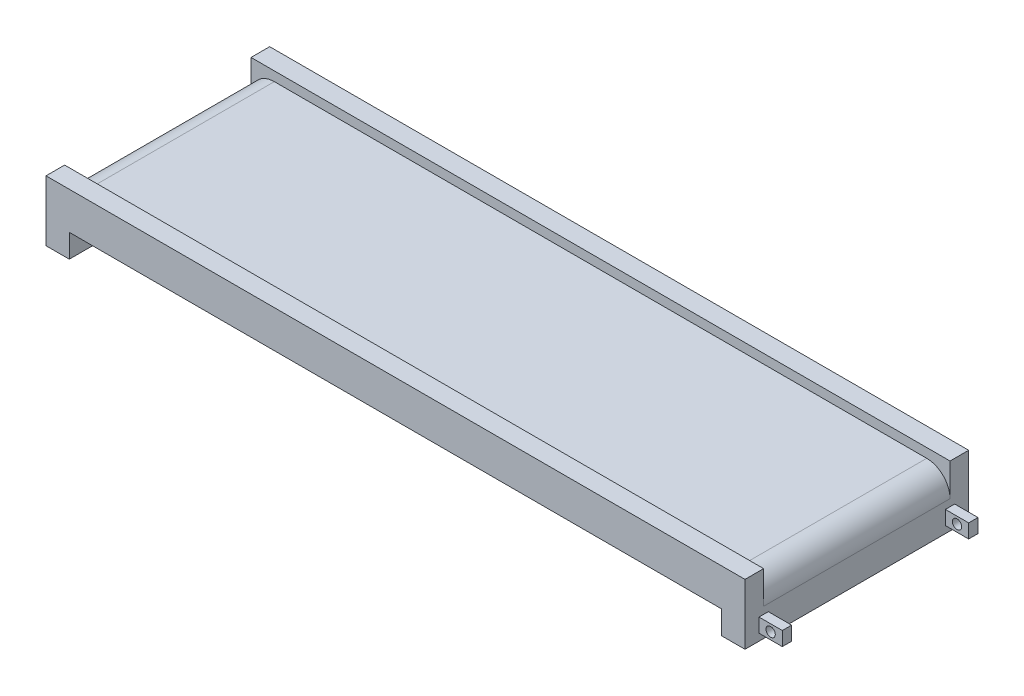
ISO-10303-21;
HEADER;
FILE_DESCRIPTION(('STEP AP214'),'2;1');
FILE_NAME('part.step','',(''),(''),'','','');
FILE_SCHEMA(('AUTOMOTIVE_DESIGN { 1 0 10303 214 1 1 1 1 }'));
ENDSEC;
DATA;
#1=APPLICATION_CONTEXT('core data for automotive mechanical design processes');
#2=APPLICATION_PROTOCOL_DEFINITION('international standard','automotive_design',2000,#1);
#3=PRODUCT_CONTEXT('',#1,'mechanical');
#4=PRODUCT('Part','Part','',(#3));
#5=PRODUCT_RELATED_PRODUCT_CATEGORY('part','',(#4));
#6=PRODUCT_DEFINITION_FORMATION('','',#4);
#7=PRODUCT_DEFINITION_CONTEXT('part definition',#1,'design');
#8=PRODUCT_DEFINITION('design','',#6,#7);
#9=PRODUCT_DEFINITION_SHAPE('','',#8);
#10=(LENGTH_UNIT() NAMED_UNIT(*) SI_UNIT(.MILLI.,.METRE.));
#11=(NAMED_UNIT(*) PLANE_ANGLE_UNIT() SI_UNIT($,.RADIAN.));
#12=(NAMED_UNIT(*) SI_UNIT($,.STERADIAN.) SOLID_ANGLE_UNIT());
#13=UNCERTAINTY_MEASURE_WITH_UNIT(LENGTH_MEASURE(1.E-05),#10,'distance_accuracy_value','');
#14=(GEOMETRIC_REPRESENTATION_CONTEXT(3) GLOBAL_UNCERTAINTY_ASSIGNED_CONTEXT((#13)) GLOBAL_UNIT_ASSIGNED_CONTEXT((#10,
#11,#12)) REPRESENTATION_CONTEXT('',''));
#15=CARTESIAN_POINT('',(0.,0.,0.));
#16=DIRECTION('',(0.,0.,1.));
#17=DIRECTION('',(1.,0.,0.));
#18=AXIS2_PLACEMENT_3D('',#15,#16,#17);
#19=CARTESIAN_POINT('',(0.,0.,0.));
#20=DIRECTION('',(0.,-1.,0.));
#21=DIRECTION('',(0.,0.,-1.));
#22=AXIS2_PLACEMENT_3D('',#19,#20,#21);
#23=PLANE('',#22);
#24=DIRECTION('',(-1.,0.,0.));
#25=VECTOR('',#24,1.);
#26=CARTESIAN_POINT('',(0.,0.,0.));
#27=LINE('',#26,#25);
#28=CARTESIAN_POINT('',(3683.,0.,0.));
#29=VERTEX_POINT('',#28);
#30=CARTESIAN_POINT('',(127.,0.,0.));
#31=VERTEX_POINT('',#30);
#32=EDGE_CURVE('E335',#29,#31,#27,.T.);
#33=ORIENTED_EDGE('',*,*,#32,.F.);
#34=DIRECTION('',(0.,0.,-1.));
#35=VECTOR('',#34,1.);
#36=CARTESIAN_POINT('',(3683.,0.,0.));
#37=LINE('',#36,#35);
#38=CARTESIAN_POINT('',(3683.,0.,1219.2));
#39=VERTEX_POINT('',#38);
#40=EDGE_CURVE('E260',#39,#29,#37,.T.);
#41=ORIENTED_EDGE('',*,*,#40,.F.);
#42=DIRECTION('',(1.,0.,0.));
#43=VECTOR('',#42,1.);
#44=CARTESIAN_POINT('',(3810.,0.,1219.2));
#45=LINE('',#44,#43);
#46=CARTESIAN_POINT('',(127.,0.,1219.2));
#47=VERTEX_POINT('',#46);
#48=EDGE_CURVE('E312',#47,#39,#45,.T.);
#49=ORIENTED_EDGE('',*,*,#48,.F.);
#50=DIRECTION('',(0.,0.,-1.));
#51=VECTOR('',#50,1.);
#52=CARTESIAN_POINT('',(127.,0.,0.));
#53=LINE('',#52,#51);
#54=EDGE_CURVE('E278',#47,#31,#53,.T.);
#55=ORIENTED_EDGE('',*,*,#54,.T.);
#56=EDGE_LOOP('',(#33,#41,#49,#55));
#57=FACE_BOUND('',#56,.T.);
#58=ADVANCED_FACE('F39',(#57),#23,.T.);
#59=CARTESIAN_POINT('',(0.,203.2,1219.2));
#60=DIRECTION('',(1.,0.,0.));
#61=DIRECTION('',(0.,0.,-1.));
#62=AXIS2_PLACEMENT_3D('',#59,#60,#61);
#63=PLANE('',#62);
#64=DIRECTION('',(0.,1.,0.));
#65=VECTOR('',#64,1.);
#66=CARTESIAN_POINT('',(0.,152.4,1117.6));
#67=LINE('',#66,#65);
#68=CARTESIAN_POINT('',(0.,25.4,1117.6));
#69=VERTEX_POINT('',#68);
#70=CARTESIAN_POINT('',(0.,203.2,1117.6));
#71=VERTEX_POINT('',#70);
#72=EDGE_CURVE('E310',#69,#71,#67,.T.);
#73=ORIENTED_EDGE('',*,*,#72,.F.);
#74=DIRECTION('',(0.,0.,1.));
#75=VECTOR('',#74,1.);
#76=CARTESIAN_POINT('',(0.,25.4,101.6));
#77=LINE('',#76,#75);
#78=CARTESIAN_POINT('',(0.,25.4,101.6));
#79=VERTEX_POINT('',#78);
#80=EDGE_CURVE('E350',#69,#79,#77,.F.);
#81=ORIENTED_EDGE('',*,*,#80,.T.);
#82=DIRECTION('',(0.,1.,0.));
#83=VECTOR('',#82,1.);
#84=CARTESIAN_POINT('',(0.,152.4,101.6));
#85=LINE('',#84,#83);
#86=CARTESIAN_POINT('',(0.,203.2,101.6));
#87=VERTEX_POINT('',#86);
#88=EDGE_CURVE('E313',#79,#87,#85,.T.);
#89=ORIENTED_EDGE('',*,*,#88,.T.);
#90=DIRECTION('',(0.,0.,1.));
#91=VECTOR('',#90,1.);
#92=CARTESIAN_POINT('',(0.,203.2,1219.2));
#93=LINE('',#92,#91);
#94=CARTESIAN_POINT('',(0.,203.2,0.));
#95=VERTEX_POINT('',#94);
#96=EDGE_CURVE('E320',#95,#87,#93,.T.);
#97=ORIENTED_EDGE('',*,*,#96,.F.);
#98=DIRECTION('',(0.,-1.,0.));
#99=VECTOR('',#98,1.);
#100=CARTESIAN_POINT('',(0.,203.2,0.));
#101=LINE('',#100,#99);
#102=CARTESIAN_POINT('',(0.,-127.,0.));
#103=VERTEX_POINT('',#102);
#104=EDGE_CURVE('E332',#95,#103,#101,.T.);
#105=ORIENTED_EDGE('',*,*,#104,.T.);
#106=DIRECTION('',(0.,0.,-1.));
#107=VECTOR('',#106,1.);
#108=CARTESIAN_POINT('',(0.,-127.,0.));
#109=LINE('',#108,#107);
#110=CARTESIAN_POINT('',(0.,-127.,1219.2));
#111=VERTEX_POINT('',#110);
#112=EDGE_CURVE('E285',#111,#103,#109,.T.);
#113=ORIENTED_EDGE('',*,*,#112,.F.);
#114=DIRECTION('',(0.,-1.,0.));
#115=VECTOR('',#114,1.);
#116=CARTESIAN_POINT('',(0.,203.2,1219.2));
#117=LINE('',#116,#115);
#118=CARTESIAN_POINT('',(0.,203.2,1219.2));
#119=VERTEX_POINT('',#118);
#120=EDGE_CURVE('E342',#119,#111,#117,.T.);
#121=ORIENTED_EDGE('',*,*,#120,.F.);
#122=EDGE_CURVE('E324',#71,#119,#93,.T.);
#123=ORIENTED_EDGE('',*,*,#122,.F.);
#124=EDGE_LOOP('',(#73,#81,#89,#97,#105,#113,#121,#123));
#125=FACE_BOUND('',#124,.T.);
#126=ADVANCED_FACE('F381',(#125),#63,.F.);
#127=CARTESIAN_POINT('',(3810.,203.2,0.));
#128=DIRECTION('',(-1.,0.,0.));
#129=DIRECTION('',(0.,0.,1.));
#130=AXIS2_PLACEMENT_3D('',#127,#128,#129);
#131=PLANE('',#130);
#132=DIRECTION('',(0.,1.,0.));
#133=VECTOR('',#132,1.);
#134=CARTESIAN_POINT('',(3810.,0.,127.));
#135=LINE('',#134,#133);
#136=CARTESIAN_POINT('',(3810.,-88.9,127.));
#137=VERTEX_POINT('',#136);
#138=CARTESIAN_POINT('',(3810.,-12.7,127.));
#139=VERTEX_POINT('',#138);
#140=EDGE_CURVE('E221',#137,#139,#135,.T.);
#141=ORIENTED_EDGE('',*,*,#140,.T.);
#142=DIRECTION('',(0.,0.,-1.));
#143=VECTOR('',#142,1.);
#144=CARTESIAN_POINT('',(3810.,-12.7,0.));
#145=LINE('',#144,#143);
#146=CARTESIAN_POINT('',(3810.,-12.7,76.2000000000001));
#147=VERTEX_POINT('',#146);
#148=EDGE_CURVE('E194',#139,#147,#145,.T.);
#149=ORIENTED_EDGE('',*,*,#148,.T.);
#150=DIRECTION('',(0.,-1.,0.));
#151=VECTOR('',#150,1.);
#152=CARTESIAN_POINT('',(3810.,0.,76.2000000000001));
#153=LINE('',#152,#151);
#154=CARTESIAN_POINT('',(3810.,-88.9000000000001,76.2000000000001));
#155=VERTEX_POINT('',#154);
#156=EDGE_CURVE('E210',#147,#155,#153,.T.);
#157=ORIENTED_EDGE('',*,*,#156,.T.);
#158=DIRECTION('',(0.,0.,1.));
#159=VECTOR('',#158,1.);
#160=CARTESIAN_POINT('',(3810.,-88.9,0.));
#161=LINE('',#160,#159);
#162=EDGE_CURVE('E55',#155,#137,#161,.T.);
#163=ORIENTED_EDGE('',*,*,#162,.T.);
#164=EDGE_LOOP('',(#141,#149,#157,#163));
#165=FACE_BOUND('',#164,.T.);
#166=DIRECTION('',(0.,0.,-1.));
#167=VECTOR('',#166,1.);
#168=CARTESIAN_POINT('',(3810.,-12.7000000000006,0.));
#169=LINE('',#168,#167);
#170=CARTESIAN_POINT('',(3810.,-12.7,1143.));
#171=VERTEX_POINT('',#170);
#172=CARTESIAN_POINT('',(3810.,-12.7,1092.2));
#173=VERTEX_POINT('',#172);
#174=EDGE_CURVE('E247',#171,#173,#169,.T.);
#175=ORIENTED_EDGE('',*,*,#174,.T.);
#176=DIRECTION('',(0.,-1.,0.));
#177=VECTOR('',#176,1.);
#178=CARTESIAN_POINT('',(3810.,0.,1092.2));
#179=LINE('',#178,#177);
#180=CARTESIAN_POINT('',(3810.,-88.9,1092.2));
#181=VERTEX_POINT('',#180);
#182=EDGE_CURVE('E199',#173,#181,#179,.T.);
#183=ORIENTED_EDGE('',*,*,#182,.T.);
#184=DIRECTION('',(0.,0.,1.));
#185=VECTOR('',#184,1.);
#186=CARTESIAN_POINT('',(3810.,-88.9,0.));
#187=LINE('',#186,#185);
#188=CARTESIAN_POINT('',(3810.,-88.9,1143.));
#189=VERTEX_POINT('',#188);
#190=EDGE_CURVE('E235',#181,#189,#187,.T.);
#191=ORIENTED_EDGE('',*,*,#190,.T.);
#192=DIRECTION('',(0.,1.,0.));
#193=VECTOR('',#192,1.);
#194=CARTESIAN_POINT('',(3810.,0.,1143.));
#195=LINE('',#194,#193);
#196=EDGE_CURVE('E63',#189,#171,#195,.T.);
#197=ORIENTED_EDGE('',*,*,#196,.T.);
#198=EDGE_LOOP('',(#175,#183,#191,#197));
#199=FACE_BOUND('',#198,.T.);
#200=DIRECTION('',(0.,1.,0.));
#201=VECTOR('',#200,1.);
#202=CARTESIAN_POINT('',(3810.,152.4,101.6));
#203=LINE('',#202,#201);
#204=CARTESIAN_POINT('',(3810.,25.4,101.6));
#205=VERTEX_POINT('',#204);
#206=CARTESIAN_POINT('',(3810.,203.2,101.6));
#207=VERTEX_POINT('',#206);
#208=EDGE_CURVE('E316',#205,#207,#203,.T.);
#209=ORIENTED_EDGE('',*,*,#208,.F.);
#210=DIRECTION('',(0.,0.,-1.));
#211=VECTOR('',#210,1.);
#212=CARTESIAN_POINT('',(3810.,25.4,1117.6));
#213=LINE('',#212,#211);
#214=CARTESIAN_POINT('',(3810.,25.4,1117.6));
#215=VERTEX_POINT('',#214);
#216=EDGE_CURVE('E353',#205,#215,#213,.F.);
#217=ORIENTED_EDGE('',*,*,#216,.T.);
#218=DIRECTION('',(0.,1.,0.));
#219=VECTOR('',#218,1.);
#220=CARTESIAN_POINT('',(3810.,152.4,1117.6));
#221=LINE('',#220,#219);
#222=CARTESIAN_POINT('',(3810.,203.2,1117.6));
#223=VERTEX_POINT('',#222);
#224=EDGE_CURVE('E305',#215,#223,#221,.T.);
#225=ORIENTED_EDGE('',*,*,#224,.T.);
#226=DIRECTION('',(0.,0.,-1.));
#227=VECTOR('',#226,1.);
#228=CARTESIAN_POINT('',(3810.,203.2,0.));
#229=LINE('',#228,#227);
#230=CARTESIAN_POINT('',(3810.,203.2,1219.2));
#231=VERTEX_POINT('',#230);
#232=EDGE_CURVE('E327',#231,#223,#229,.T.);
#233=ORIENTED_EDGE('',*,*,#232,.F.);
#234=DIRECTION('',(0.,-1.,0.));
#235=VECTOR('',#234,1.);
#236=CARTESIAN_POINT('',(3810.,203.2,1219.2));
#237=LINE('',#236,#235);
#238=CARTESIAN_POINT('',(3810.,-127.,1219.2));
#239=VERTEX_POINT('',#238);
#240=EDGE_CURVE('E340',#231,#239,#237,.T.);
#241=ORIENTED_EDGE('',*,*,#240,.T.);
#242=DIRECTION('',(0.,0.,1.));
#243=VECTOR('',#242,1.);
#244=CARTESIAN_POINT('',(3810.,-127.,0.));
#245=LINE('',#244,#243);
#246=CARTESIAN_POINT('',(3810.,-127.,0.));
#247=VERTEX_POINT('',#246);
#248=EDGE_CURVE('E269',#247,#239,#245,.T.);
#249=ORIENTED_EDGE('',*,*,#248,.F.);
#250=DIRECTION('',(0.,-1.,0.));
#251=VECTOR('',#250,1.);
#252=CARTESIAN_POINT('',(3810.,203.2,0.));
#253=LINE('',#252,#251);
#254=CARTESIAN_POINT('',(3810.,203.2,0.));
#255=VERTEX_POINT('',#254);
#256=EDGE_CURVE('E338',#255,#247,#253,.T.);
#257=ORIENTED_EDGE('',*,*,#256,.F.);
#258=EDGE_CURVE('E326',#207,#255,#229,.T.);
#259=ORIENTED_EDGE('',*,*,#258,.F.);
#260=EDGE_LOOP('',(#209,#217,#225,#233,#241,#249,#257,#259));
#261=FACE_BOUND('',#260,.T.);
#262=ADVANCED_FACE('F370',(#165,#199,#261),#131,.F.);
#263=CARTESIAN_POINT('',(0.,203.2,0.));
#264=DIRECTION('',(0.,-1.,0.));
#265=DIRECTION('',(0.,0.,-1.));
#266=AXIS2_PLACEMENT_3D('',#263,#264,#265);
#267=PLANE('',#266);
#268=DIRECTION('',(-1.,0.,0.));
#269=VECTOR('',#268,1.);
#270=CARTESIAN_POINT('',(0.,203.2,1117.6));
#271=LINE('',#270,#269);
#272=EDGE_CURVE('E297',#223,#71,#271,.T.);
#273=ORIENTED_EDGE('',*,*,#272,.T.);
#274=ORIENTED_EDGE('',*,*,#122,.T.);
#275=DIRECTION('',(1.,0.,0.));
#276=VECTOR('',#275,1.);
#277=CARTESIAN_POINT('',(3810.,203.2,1219.2));
#278=LINE('',#277,#276);
#279=EDGE_CURVE('E323',#119,#231,#278,.T.);
#280=ORIENTED_EDGE('',*,*,#279,.T.);
#281=ORIENTED_EDGE('',*,*,#232,.T.);
#282=EDGE_LOOP('',(#273,#274,#280,#281));
#283=FACE_BOUND('',#282,.T.);
#284=ADVANCED_FACE('F394',(#283),#267,.F.);
#285=DIRECTION('',(1.,0.,0.));
#286=VECTOR('',#285,1.);
#287=CARTESIAN_POINT('',(0.,203.2,101.6));
#288=LINE('',#287,#286);
#289=EDGE_CURVE('E302',#87,#207,#288,.T.);
#290=ORIENTED_EDGE('',*,*,#289,.T.);
#291=ORIENTED_EDGE('',*,*,#258,.T.);
#292=DIRECTION('',(-1.,0.,0.));
#293=VECTOR('',#292,1.);
#294=CARTESIAN_POINT('',(0.,203.2,0.));
#295=LINE('',#294,#293);
#296=EDGE_CURVE('E330',#255,#95,#295,.T.);
#297=ORIENTED_EDGE('',*,*,#296,.T.);
#298=ORIENTED_EDGE('',*,*,#96,.T.);
#299=EDGE_LOOP('',(#290,#291,#297,#298));
#300=FACE_BOUND('',#299,.T.);
#301=ADVANCED_FACE('F377',(#300),#267,.F.);
#302=CARTESIAN_POINT('',(3810.,203.2,1219.2));
#303=DIRECTION('',(0.,0.,-1.));
#304=DIRECTION('',(-1.,0.,0.));
#305=AXIS2_PLACEMENT_3D('',#302,#303,#304);
#306=PLANE('',#305);
#307=ORIENTED_EDGE('',*,*,#120,.T.);
#308=DIRECTION('',(-1.,0.,0.));
#309=VECTOR('',#308,1.);
#310=CARTESIAN_POINT('',(0.,-127.,1219.2));
#311=LINE('',#310,#309);
#312=CARTESIAN_POINT('',(127.,-127.,1219.2));
#313=VERTEX_POINT('',#312);
#314=EDGE_CURVE('E282',#313,#111,#311,.T.);
#315=ORIENTED_EDGE('',*,*,#314,.F.);
#316=DIRECTION('',(0.,1.,0.));
#317=VECTOR('',#316,1.);
#318=CARTESIAN_POINT('',(127.,-127.,1219.2));
#319=LINE('',#318,#317);
#320=EDGE_CURVE('E295',#313,#47,#319,.T.);
#321=ORIENTED_EDGE('',*,*,#320,.T.);
#322=ORIENTED_EDGE('',*,*,#48,.T.);
#323=DIRECTION('',(0.,1.,0.));
#324=VECTOR('',#323,1.);
#325=CARTESIAN_POINT('',(3683.,-127.,1219.2));
#326=LINE('',#325,#324);
#327=CARTESIAN_POINT('',(3683.,-127.,1219.2));
#328=VERTEX_POINT('',#327);
#329=EDGE_CURVE('E276',#328,#39,#326,.T.);
#330=ORIENTED_EDGE('',*,*,#329,.F.);
#331=DIRECTION('',(-1.,0.,0.));
#332=VECTOR('',#331,1.);
#333=CARTESIAN_POINT('',(0.,-127.,1219.2));
#334=LINE('',#333,#332);
#335=EDGE_CURVE('E261',#239,#328,#334,.T.);
#336=ORIENTED_EDGE('',*,*,#335,.F.);
#337=ORIENTED_EDGE('',*,*,#240,.F.);
#338=ORIENTED_EDGE('',*,*,#279,.F.);
#339=EDGE_LOOP('',(#307,#315,#321,#322,#330,#336,#337,#338));
#340=FACE_BOUND('',#339,.T.);
#341=ADVANCED_FACE('F400',(#340),#306,.F.);
#342=CARTESIAN_POINT('',(0.,203.2,0.));
#343=DIRECTION('',(0.,0.,1.));
#344=DIRECTION('',(1.,0.,0.));
#345=AXIS2_PLACEMENT_3D('',#342,#343,#344);
#346=PLANE('',#345);
#347=ORIENTED_EDGE('',*,*,#256,.T.);
#348=DIRECTION('',(1.,0.,0.));
#349=VECTOR('',#348,1.);
#350=CARTESIAN_POINT('',(0.,-127.,0.));
#351=LINE('',#350,#349);
#352=CARTESIAN_POINT('',(3683.,-127.,0.));
#353=VERTEX_POINT('',#352);
#354=EDGE_CURVE('E266',#353,#247,#351,.T.);
#355=ORIENTED_EDGE('',*,*,#354,.F.);
#356=DIRECTION('',(0.,1.,0.));
#357=VECTOR('',#356,1.);
#358=CARTESIAN_POINT('',(3683.,-127.,0.));
#359=LINE('',#358,#357);
#360=EDGE_CURVE('E272',#353,#29,#359,.T.);
#361=ORIENTED_EDGE('',*,*,#360,.T.);
#362=ORIENTED_EDGE('',*,*,#32,.T.);
#363=DIRECTION('',(0.,1.,0.));
#364=VECTOR('',#363,1.);
#365=CARTESIAN_POINT('',(127.,-127.,0.));
#366=LINE('',#365,#364);
#367=CARTESIAN_POINT('',(127.,-127.,0.));
#368=VERTEX_POINT('',#367);
#369=EDGE_CURVE('E290',#368,#31,#366,.T.);
#370=ORIENTED_EDGE('',*,*,#369,.F.);
#371=DIRECTION('',(1.,0.,0.));
#372=VECTOR('',#371,1.);
#373=CARTESIAN_POINT('',(0.,-127.,0.));
#374=LINE('',#373,#372);
#375=EDGE_CURVE('E288',#103,#368,#374,.T.);
#376=ORIENTED_EDGE('',*,*,#375,.F.);
#377=ORIENTED_EDGE('',*,*,#104,.F.);
#378=ORIENTED_EDGE('',*,*,#296,.F.);
#379=EDGE_LOOP('',(#347,#355,#361,#362,#370,#376,#377,#378));
#380=FACE_BOUND('',#379,.T.);
#381=ADVANCED_FACE('F423',(#380),#346,.F.);
#382=CARTESIAN_POINT('',(0.,152.4,1117.6));
#383=DIRECTION('',(0.,0.,-1.));
#384=DIRECTION('',(-1.,0.,0.));
#385=AXIS2_PLACEMENT_3D('',#382,#383,#384);
#386=PLANE('',#385);
#387=ORIENTED_EDGE('',*,*,#272,.F.);
#388=ORIENTED_EDGE('',*,*,#224,.F.);
#389=CARTESIAN_POINT('',(3683.,25.4,1117.6));
#390=DIRECTION('',(0.,0.,-1.));
#391=DIRECTION('',(-1.,0.,0.));
#392=AXIS2_PLACEMENT_3D('',#389,#390,#391);
#393=CIRCLE('',#392,127.);
#394=CARTESIAN_POINT('',(3683.,152.4,1117.6));
#395=VERTEX_POINT('',#394);
#396=EDGE_CURVE('E11',#215,#395,#393,.F.);
#397=ORIENTED_EDGE('',*,*,#396,.T.);
#398=DIRECTION('',(-1.,0.,0.));
#399=VECTOR('',#398,1.);
#400=CARTESIAN_POINT('',(0.,152.4,1117.6));
#401=LINE('',#400,#399);
#402=CARTESIAN_POINT('',(127.,152.4,1117.6));
#403=VERTEX_POINT('',#402);
#404=EDGE_CURVE('E298',#395,#403,#401,.T.);
#405=ORIENTED_EDGE('',*,*,#404,.T.);
#406=CARTESIAN_POINT('',(127.,25.4,1117.6));
#407=DIRECTION('',(0.,0.,-1.));
#408=DIRECTION('',(-1.,0.,0.));
#409=AXIS2_PLACEMENT_3D('',#406,#407,#408);
#410=CIRCLE('',#409,127.);
#411=EDGE_CURVE('E356',#403,#69,#410,.F.);
#412=ORIENTED_EDGE('',*,*,#411,.T.);
#413=ORIENTED_EDGE('',*,*,#72,.T.);
#414=EDGE_LOOP('',(#387,#388,#397,#405,#412,#413));
#415=FACE_BOUND('',#414,.T.);
#416=ADVANCED_FACE('F392',(#415),#386,.T.);
#417=CARTESIAN_POINT('',(0.,152.4,101.6));
#418=DIRECTION('',(0.,0.,1.));
#419=DIRECTION('',(1.,0.,0.));
#420=AXIS2_PLACEMENT_3D('',#417,#418,#419);
#421=PLANE('',#420);
#422=ORIENTED_EDGE('',*,*,#289,.F.);
#423=ORIENTED_EDGE('',*,*,#88,.F.);
#424=CARTESIAN_POINT('',(127.,25.4,101.6));
#425=DIRECTION('',(0.,0.,1.));
#426=DIRECTION('',(1.,0.,0.));
#427=AXIS2_PLACEMENT_3D('',#424,#425,#426);
#428=CIRCLE('',#427,127.);
#429=CARTESIAN_POINT('',(127.,152.4,101.6));
#430=VERTEX_POINT('',#429);
#431=EDGE_CURVE('E359',#79,#430,#428,.F.);
#432=ORIENTED_EDGE('',*,*,#431,.T.);
#433=DIRECTION('',(1.,0.,0.));
#434=VECTOR('',#433,1.);
#435=CARTESIAN_POINT('',(0.,152.4,101.6));
#436=LINE('',#435,#434);
#437=CARTESIAN_POINT('',(3683.,152.4,101.6));
#438=VERTEX_POINT('',#437);
#439=EDGE_CURVE('E301',#430,#438,#436,.T.);
#440=ORIENTED_EDGE('',*,*,#439,.T.);
#441=CARTESIAN_POINT('',(3683.,25.4,101.6));
#442=DIRECTION('',(0.,0.,1.));
#443=DIRECTION('',(1.,0.,0.));
#444=AXIS2_PLACEMENT_3D('',#441,#442,#443);
#445=CIRCLE('',#444,127.);
#446=EDGE_CURVE('E48',#438,#205,#445,.F.);
#447=ORIENTED_EDGE('',*,*,#446,.T.);
#448=ORIENTED_EDGE('',*,*,#208,.T.);
#449=EDGE_LOOP('',(#422,#423,#432,#440,#447,#448));
#450=FACE_BOUND('',#449,.T.);
#451=ADVANCED_FACE('F364',(#450),#421,.T.);
#452=CARTESIAN_POINT('',(0.,152.4,0.));
#453=DIRECTION('',(0.,1.,0.));
#454=DIRECTION('',(0.,0.,1.));
#455=AXIS2_PLACEMENT_3D('',#452,#453,#454);
#456=PLANE('',#455);
#457=ORIENTED_EDGE('',*,*,#439,.F.);
#458=DIRECTION('',(0.,0.,1.));
#459=VECTOR('',#458,1.);
#460=CARTESIAN_POINT('',(127.,152.4,1117.6));
#461=LINE('',#460,#459);
#462=EDGE_CURVE('E347',#430,#403,#461,.T.);
#463=ORIENTED_EDGE('',*,*,#462,.T.);
#464=ORIENTED_EDGE('',*,*,#404,.F.);
#465=DIRECTION('',(0.,0.,-1.));
#466=VECTOR('',#465,1.);
#467=CARTESIAN_POINT('',(3683.,152.4,101.6));
#468=LINE('',#467,#466);
#469=EDGE_CURVE('E344',#395,#438,#468,.T.);
#470=ORIENTED_EDGE('',*,*,#469,.T.);
#471=EDGE_LOOP('',(#457,#463,#464,#470));
#472=FACE_BOUND('',#471,.T.);
#473=ADVANCED_FACE('F389',(#472),#456,.T.);
#474=CARTESIAN_POINT('',(127.,-127.,0.));
#475=DIRECTION('',(1.,0.,0.));
#476=DIRECTION('',(0.,0.,-1.));
#477=AXIS2_PLACEMENT_3D('',#474,#475,#476);
#478=PLANE('',#477);
#479=ORIENTED_EDGE('',*,*,#54,.F.);
#480=ORIENTED_EDGE('',*,*,#320,.F.);
#481=DIRECTION('',(0.,0.,-1.));
#482=VECTOR('',#481,1.);
#483=CARTESIAN_POINT('',(127.,-127.,0.));
#484=LINE('',#483,#482);
#485=EDGE_CURVE('E279',#313,#368,#484,.T.);
#486=ORIENTED_EDGE('',*,*,#485,.T.);
#487=ORIENTED_EDGE('',*,*,#369,.T.);
#488=EDGE_LOOP('',(#479,#480,#486,#487));
#489=FACE_BOUND('',#488,.T.);
#490=ADVANCED_FACE('F409',(#489),#478,.T.);
#491=CARTESIAN_POINT('',(0.,-127.,0.));
#492=DIRECTION('',(0.,-1.,0.));
#493=DIRECTION('',(0.,0.,-1.));
#494=AXIS2_PLACEMENT_3D('',#491,#492,#493);
#495=PLANE('',#494);
#496=ORIENTED_EDGE('',*,*,#485,.F.);
#497=ORIENTED_EDGE('',*,*,#314,.T.);
#498=ORIENTED_EDGE('',*,*,#112,.T.);
#499=ORIENTED_EDGE('',*,*,#375,.T.);
#500=EDGE_LOOP('',(#496,#497,#498,#499));
#501=FACE_BOUND('',#500,.T.);
#502=ADVANCED_FACE('F404',(#501),#495,.T.);
#503=CARTESIAN_POINT('',(3683.,-127.,0.));
#504=DIRECTION('',(1.,0.,0.));
#505=DIRECTION('',(0.,0.,-1.));
#506=AXIS2_PLACEMENT_3D('',#503,#504,#505);
#507=PLANE('',#506);
#508=ORIENTED_EDGE('',*,*,#40,.T.);
#509=ORIENTED_EDGE('',*,*,#360,.F.);
#510=DIRECTION('',(0.,0.,-1.));
#511=VECTOR('',#510,1.);
#512=CARTESIAN_POINT('',(3683.,-127.,0.));
#513=LINE('',#512,#511);
#514=EDGE_CURVE('E264',#328,#353,#513,.T.);
#515=ORIENTED_EDGE('',*,*,#514,.F.);
#516=ORIENTED_EDGE('',*,*,#329,.T.);
#517=EDGE_LOOP('',(#508,#509,#515,#516));
#518=FACE_BOUND('',#517,.T.);
#519=ADVANCED_FACE('F418',(#518),#507,.F.);
#520=CARTESIAN_POINT('',(0.,-127.,0.));
#521=DIRECTION('',(0.,-1.,0.));
#522=DIRECTION('',(0.,0.,-1.));
#523=AXIS2_PLACEMENT_3D('',#520,#521,#522);
#524=PLANE('',#523);
#525=ORIENTED_EDGE('',*,*,#335,.T.);
#526=ORIENTED_EDGE('',*,*,#514,.T.);
#527=ORIENTED_EDGE('',*,*,#354,.T.);
#528=ORIENTED_EDGE('',*,*,#248,.T.);
#529=EDGE_LOOP('',(#525,#526,#527,#528));
#530=FACE_BOUND('',#529,.T.);
#531=ADVANCED_FACE('F421',(#530),#524,.T.);
#532=CARTESIAN_POINT('',(127.,25.4,0.));
#533=DIRECTION('',(0.,0.,-1.));
#534=DIRECTION('',(-1.,0.,0.));
#535=AXIS2_PLACEMENT_3D('',#532,#533,#534);
#536=CYLINDRICAL_SURFACE('',#535,127.);
#537=ORIENTED_EDGE('',*,*,#431,.F.);
#538=ORIENTED_EDGE('',*,*,#80,.F.);
#539=ORIENTED_EDGE('',*,*,#411,.F.);
#540=ORIENTED_EDGE('',*,*,#462,.F.);
#541=EDGE_LOOP('',(#537,#538,#539,#540));
#542=FACE_BOUND('',#541,.T.);
#543=ADVANCED_FACE('F387',(#542),#536,.T.);
#544=CARTESIAN_POINT('',(3683.,25.4,0.));
#545=DIRECTION('',(0.,0.,1.));
#546=DIRECTION('',(1.,0.,0.));
#547=AXIS2_PLACEMENT_3D('',#544,#545,#546);
#548=CYLINDRICAL_SURFACE('',#547,127.);
#549=ORIENTED_EDGE('',*,*,#396,.F.);
#550=ORIENTED_EDGE('',*,*,#216,.F.);
#551=ORIENTED_EDGE('',*,*,#446,.F.);
#552=ORIENTED_EDGE('',*,*,#469,.F.);
#553=EDGE_LOOP('',(#549,#550,#551,#552));
#554=FACE_BOUND('',#553,.T.);
#555=ADVANCED_FACE('F41',(#554),#548,.T.);
#556=CARTESIAN_POINT('',(3937.,0.,1092.2));
#557=DIRECTION('',(0.,0.,-1.));
#558=DIRECTION('',(-1.,0.,0.));
#559=AXIS2_PLACEMENT_3D('',#556,#557,#558);
#560=PLANE('',#559);
#561=CARTESIAN_POINT('',(3873.5,-50.8,1092.2));
#562=DIRECTION('',(0.,0.,-1.));
#563=DIRECTION('',(-1.,0.,0.));
#564=AXIS2_PLACEMENT_3D('',#561,#562,#563);
#565=CIRCLE('',#564,25.3999999999998);
#566=CARTESIAN_POINT('',(3898.9,-50.8,1092.2));
#567=VERTEX_POINT('',#566);
#568=EDGE_CURVE('E222',#567,#567,#565,.T.);
#569=ORIENTED_EDGE('',*,*,#568,.F.);
#570=EDGE_LOOP('',(#569));
#571=FACE_BOUND('',#570,.T.);
#572=ORIENTED_EDGE('',*,*,#182,.F.);
#573=DIRECTION('',(-1.,0.,0.));
#574=VECTOR('',#573,1.);
#575=CARTESIAN_POINT('',(3937.,-12.7,1092.2));
#576=LINE('',#575,#574);
#577=CARTESIAN_POINT('',(3937.,-12.7,1092.2));
#578=VERTEX_POINT('',#577);
#579=EDGE_CURVE('E258',#578,#173,#576,.T.);
#580=ORIENTED_EDGE('',*,*,#579,.F.);
#581=DIRECTION('',(0.,-1.,0.));
#582=VECTOR('',#581,1.);
#583=CARTESIAN_POINT('',(3937.,0.,1092.2));
#584=LINE('',#583,#582);
#585=CARTESIAN_POINT('',(3937.,-88.9,1092.2));
#586=VERTEX_POINT('',#585);
#587=EDGE_CURVE('E231',#578,#586,#584,.T.);
#588=ORIENTED_EDGE('',*,*,#587,.T.);
#589=DIRECTION('',(-1.,0.,0.));
#590=VECTOR('',#589,1.);
#591=CARTESIAN_POINT('',(3937.,-88.9,1092.2));
#592=LINE('',#591,#590);
#593=EDGE_CURVE('E244',#586,#181,#592,.T.);
#594=ORIENTED_EDGE('',*,*,#593,.T.);
#595=EDGE_LOOP('',(#572,#580,#588,#594));
#596=FACE_BOUND('',#595,.T.);
#597=ADVANCED_FACE('F454',(#571,#596),#560,.T.);
#598=CARTESIAN_POINT('',(3937.,-12.7000000000006,0.));
#599=DIRECTION('',(0.,1.,0.));
#600=DIRECTION('',(0.,0.,1.));
#601=AXIS2_PLACEMENT_3D('',#598,#599,#600);
#602=PLANE('',#601);
#603=ORIENTED_EDGE('',*,*,#174,.F.);
#604=DIRECTION('',(-1.,0.,0.));
#605=VECTOR('',#604,1.);
#606=CARTESIAN_POINT('',(3937.,-12.7,1143.));
#607=LINE('',#606,#605);
#608=CARTESIAN_POINT('',(3937.,-12.7,1143.));
#609=VERTEX_POINT('',#608);
#610=EDGE_CURVE('E256',#609,#171,#607,.T.);
#611=ORIENTED_EDGE('',*,*,#610,.F.);
#612=DIRECTION('',(0.,0.,-1.));
#613=VECTOR('',#612,1.);
#614=CARTESIAN_POINT('',(3937.,-12.7000000000006,0.));
#615=LINE('',#614,#613);
#616=EDGE_CURVE('E234',#609,#578,#615,.T.);
#617=ORIENTED_EDGE('',*,*,#616,.T.);
#618=ORIENTED_EDGE('',*,*,#579,.T.);
#619=EDGE_LOOP('',(#603,#611,#617,#618));
#620=FACE_BOUND('',#619,.T.);
#621=ADVANCED_FACE('F457',(#620),#602,.T.);
#622=CARTESIAN_POINT('',(3937.,0.,1143.));
#623=DIRECTION('',(0.,0.,1.));
#624=DIRECTION('',(1.,0.,0.));
#625=AXIS2_PLACEMENT_3D('',#622,#623,#624);
#626=PLANE('',#625);
#627=CARTESIAN_POINT('',(3873.5,-50.8,1143.));
#628=DIRECTION('',(0.,0.,1.));
#629=DIRECTION('',(1.,0.,0.));
#630=AXIS2_PLACEMENT_3D('',#627,#628,#629);
#631=CIRCLE('',#630,25.3999999999998);
#632=CARTESIAN_POINT('',(3898.9,-50.8,1143.));
#633=VERTEX_POINT('',#632);
#634=EDGE_CURVE('E502',#633,#633,#631,.T.);
#635=ORIENTED_EDGE('',*,*,#634,.F.);
#636=EDGE_LOOP('',(#635));
#637=FACE_BOUND('',#636,.T.);
#638=ORIENTED_EDGE('',*,*,#196,.F.);
#639=DIRECTION('',(-1.,0.,0.));
#640=VECTOR('',#639,1.);
#641=CARTESIAN_POINT('',(3937.,-88.9,1143.));
#642=LINE('',#641,#640);
#643=CARTESIAN_POINT('',(3937.,-88.9,1143.));
#644=VERTEX_POINT('',#643);
#645=EDGE_CURVE('E254',#644,#189,#642,.T.);
#646=ORIENTED_EDGE('',*,*,#645,.F.);
#647=DIRECTION('',(0.,1.,0.));
#648=VECTOR('',#647,1.);
#649=CARTESIAN_POINT('',(3937.,0.,1143.));
#650=LINE('',#649,#648);
#651=EDGE_CURVE('E238',#644,#609,#650,.T.);
#652=ORIENTED_EDGE('',*,*,#651,.T.);
#653=ORIENTED_EDGE('',*,*,#610,.T.);
#654=EDGE_LOOP('',(#638,#646,#652,#653));
#655=FACE_BOUND('',#654,.T.);
#656=ADVANCED_FACE('F461',(#637,#655),#626,.T.);
#657=CARTESIAN_POINT('',(3937.,-88.9,0.));
#658=DIRECTION('',(0.,-1.,0.));
#659=DIRECTION('',(0.,0.,-1.));
#660=AXIS2_PLACEMENT_3D('',#657,#658,#659);
#661=PLANE('',#660);
#662=ORIENTED_EDGE('',*,*,#190,.F.);
#663=ORIENTED_EDGE('',*,*,#593,.F.);
#664=DIRECTION('',(0.,0.,1.));
#665=VECTOR('',#664,1.);
#666=CARTESIAN_POINT('',(3937.,-88.9,0.));
#667=LINE('',#666,#665);
#668=EDGE_CURVE('E241',#586,#644,#667,.T.);
#669=ORIENTED_EDGE('',*,*,#668,.T.);
#670=ORIENTED_EDGE('',*,*,#645,.T.);
#671=EDGE_LOOP('',(#662,#663,#669,#670));
#672=FACE_BOUND('',#671,.T.);
#673=ADVANCED_FACE('F465',(#672),#661,.T.);
#674=CARTESIAN_POINT('',(3937.,0.,0.));
#675=DIRECTION('',(1.,0.,0.));
#676=DIRECTION('',(0.,0.,-1.));
#677=AXIS2_PLACEMENT_3D('',#674,#675,#676);
#678=PLANE('',#677);
#679=ORIENTED_EDGE('',*,*,#587,.F.);
#680=ORIENTED_EDGE('',*,*,#616,.F.);
#681=ORIENTED_EDGE('',*,*,#651,.F.);
#682=ORIENTED_EDGE('',*,*,#668,.F.);
#683=EDGE_LOOP('',(#679,#680,#681,#682));
#684=FACE_BOUND('',#683,.T.);
#685=ADVANCED_FACE('F469',(#684),#678,.T.);
#686=CARTESIAN_POINT('',(3937.,-12.7,0.));
#687=DIRECTION('',(0.,1.,0.));
#688=DIRECTION('',(0.,0.,1.));
#689=AXIS2_PLACEMENT_3D('',#686,#687,#688);
#690=PLANE('',#689);
#691=ORIENTED_EDGE('',*,*,#148,.F.);
#692=DIRECTION('',(-1.,0.,0.));
#693=VECTOR('',#692,1.);
#694=CARTESIAN_POINT('',(3937.,-12.7,127.));
#695=LINE('',#694,#693);
#696=CARTESIAN_POINT('',(3937.,-12.7,127.));
#697=VERTEX_POINT('',#696);
#698=EDGE_CURVE('E188',#697,#139,#695,.T.);
#699=ORIENTED_EDGE('',*,*,#698,.F.);
#700=DIRECTION('',(0.,0.,-1.));
#701=VECTOR('',#700,1.);
#702=CARTESIAN_POINT('',(3937.,-12.7,0.));
#703=LINE('',#702,#701);
#704=CARTESIAN_POINT('',(3937.,-12.7,76.2000000000001));
#705=VERTEX_POINT('',#704);
#706=EDGE_CURVE('E191',#697,#705,#703,.T.);
#707=ORIENTED_EDGE('',*,*,#706,.T.);
#708=DIRECTION('',(-1.,0.,0.));
#709=VECTOR('',#708,1.);
#710=CARTESIAN_POINT('',(3937.,-12.7,76.2000000000001));
#711=LINE('',#710,#709);
#712=EDGE_CURVE('E219',#705,#147,#711,.T.);
#713=ORIENTED_EDGE('',*,*,#712,.T.);
#714=EDGE_LOOP('',(#691,#699,#707,#713));
#715=FACE_BOUND('',#714,.T.);
#716=ADVANCED_FACE('F190',(#715),#690,.T.);
#717=CARTESIAN_POINT('',(3937.,0.,127.));
#718=DIRECTION('',(0.,0.,1.));
#719=DIRECTION('',(1.,0.,0.));
#720=AXIS2_PLACEMENT_3D('',#717,#718,#719);
#721=PLANE('',#720);
#722=CARTESIAN_POINT('',(3873.5,-50.8,127.));
#723=DIRECTION('',(0.,0.,1.));
#724=DIRECTION('',(1.,0.,0.));
#725=AXIS2_PLACEMENT_3D('',#722,#723,#724);
#726=CIRCLE('',#725,25.3999999999998);
#727=CARTESIAN_POINT('',(3898.9,-50.8,127.));
#728=VERTEX_POINT('',#727);
#729=EDGE_CURVE('E499',#728,#728,#726,.T.);
#730=ORIENTED_EDGE('',*,*,#729,.F.);
#731=EDGE_LOOP('',(#730));
#732=FACE_BOUND('',#731,.T.);
#733=ORIENTED_EDGE('',*,*,#140,.F.);
#734=DIRECTION('',(-1.,0.,0.));
#735=VECTOR('',#734,1.);
#736=CARTESIAN_POINT('',(3937.,-88.9,127.));
#737=LINE('',#736,#735);
#738=CARTESIAN_POINT('',(3937.,-88.9,127.));
#739=VERTEX_POINT('',#738);
#740=EDGE_CURVE('E200',#739,#137,#737,.T.);
#741=ORIENTED_EDGE('',*,*,#740,.F.);
#742=DIRECTION('',(0.,1.,0.));
#743=VECTOR('',#742,1.);
#744=CARTESIAN_POINT('',(3937.,0.,127.));
#745=LINE('',#744,#743);
#746=EDGE_CURVE('E206',#739,#697,#745,.T.);
#747=ORIENTED_EDGE('',*,*,#746,.T.);
#748=ORIENTED_EDGE('',*,*,#698,.T.);
#749=EDGE_LOOP('',(#733,#741,#747,#748));
#750=FACE_BOUND('',#749,.T.);
#751=ADVANCED_FACE('F212',(#732,#750),#721,.T.);
#752=CARTESIAN_POINT('',(3937.,-88.9,0.));
#753=DIRECTION('',(0.,-1.,0.));
#754=DIRECTION('',(0.,0.,-1.));
#755=AXIS2_PLACEMENT_3D('',#752,#753,#754);
#756=PLANE('',#755);
#757=ORIENTED_EDGE('',*,*,#162,.F.);
#758=DIRECTION('',(-1.,0.,0.));
#759=VECTOR('',#758,1.);
#760=CARTESIAN_POINT('',(3937.,-88.9,76.2000000000001));
#761=LINE('',#760,#759);
#762=CARTESIAN_POINT('',(3937.,-88.9,76.2000000000001));
#763=VERTEX_POINT('',#762);
#764=EDGE_CURVE('E228',#763,#155,#761,.T.);
#765=ORIENTED_EDGE('',*,*,#764,.F.);
#766=DIRECTION('',(0.,0.,1.));
#767=VECTOR('',#766,1.);
#768=CARTESIAN_POINT('',(3937.,-88.9,0.));
#769=LINE('',#768,#767);
#770=EDGE_CURVE('E213',#763,#739,#769,.T.);
#771=ORIENTED_EDGE('',*,*,#770,.T.);
#772=ORIENTED_EDGE('',*,*,#740,.T.);
#773=EDGE_LOOP('',(#757,#765,#771,#772));
#774=FACE_BOUND('',#773,.T.);
#775=ADVANCED_FACE('F478',(#774),#756,.T.);
#776=CARTESIAN_POINT('',(3937.,0.,76.2000000000001));
#777=DIRECTION('',(0.,0.,-1.));
#778=DIRECTION('',(0.,1.,0.));
#779=AXIS2_PLACEMENT_3D('',#776,#777,#778);
#780=PLANE('',#779);
#781=CARTESIAN_POINT('',(3873.5,-50.8,76.2000000000001));
#782=DIRECTION('',(0.,0.,-1.));
#783=DIRECTION('',(0.,1.,0.));
#784=AXIS2_PLACEMENT_3D('',#781,#782,#783);
#785=CIRCLE('',#784,25.3999999999998);
#786=CARTESIAN_POINT('',(3898.9,-50.8,76.2000000000001));
#787=VERTEX_POINT('',#786);
#788=EDGE_CURVE('E43',#787,#787,#785,.T.);
#789=ORIENTED_EDGE('',*,*,#788,.F.);
#790=EDGE_LOOP('',(#789));
#791=FACE_BOUND('',#790,.T.);
#792=ORIENTED_EDGE('',*,*,#156,.F.);
#793=ORIENTED_EDGE('',*,*,#712,.F.);
#794=DIRECTION('',(0.,-1.,0.));
#795=VECTOR('',#794,1.);
#796=CARTESIAN_POINT('',(3937.,0.,76.2000000000001));
#797=LINE('',#796,#795);
#798=EDGE_CURVE('E209',#705,#763,#797,.T.);
#799=ORIENTED_EDGE('',*,*,#798,.T.);
#800=ORIENTED_EDGE('',*,*,#764,.T.);
#801=EDGE_LOOP('',(#792,#793,#799,#800));
#802=FACE_BOUND('',#801,.T.);
#803=ADVANCED_FACE('F482',(#791,#802),#780,.T.);
#804=CARTESIAN_POINT('',(3937.,0.,0.));
#805=DIRECTION('',(1.,0.,0.));
#806=DIRECTION('',(0.,0.,-1.));
#807=AXIS2_PLACEMENT_3D('',#804,#805,#806);
#808=PLANE('',#807);
#809=ORIENTED_EDGE('',*,*,#706,.F.);
#810=ORIENTED_EDGE('',*,*,#746,.F.);
#811=ORIENTED_EDGE('',*,*,#770,.F.);
#812=ORIENTED_EDGE('',*,*,#798,.F.);
#813=EDGE_LOOP('',(#809,#810,#811,#812));
#814=FACE_BOUND('',#813,.T.);
#815=ADVANCED_FACE('F204',(#814),#808,.T.);
#816=CARTESIAN_POINT('',(3873.5,-50.8,-127.));
#817=DIRECTION('',(0.,0.,1.));
#818=DIRECTION('',(1.,0.,0.));
#819=AXIS2_PLACEMENT_3D('',#816,#817,#818);
#820=CYLINDRICAL_SURFACE('',#819,25.3999999999998);
#821=CARTESIAN_POINT('',(3898.9,-50.8,127.));
#822=CARTESIAN_POINT('',(3898.9,-50.8,126.470833333333));
#823=CARTESIAN_POINT('',(3898.9,-50.8,125.941666666667));
#824=CARTESIAN_POINT('',(3898.9,-50.8,124.883333333333));
#825=CARTESIAN_POINT('',(3898.9,-50.8,124.354166666667));
#826=CARTESIAN_POINT('',(3898.9,-50.8,123.295833333333));
#827=CARTESIAN_POINT('',(3898.9,-50.8,122.766666666667));
#828=CARTESIAN_POINT('',(3898.9,-50.8,121.708333333333));
#829=CARTESIAN_POINT('',(3898.9,-50.8,121.179166666667));
#830=CARTESIAN_POINT('',(3898.9,-50.8,120.120833333333));
#831=CARTESIAN_POINT('',(3898.9,-50.8,119.591666666667));
#832=CARTESIAN_POINT('',(3898.9,-50.8,118.533333333333));
#833=CARTESIAN_POINT('',(3898.9,-50.8,118.004166666667));
#834=CARTESIAN_POINT('',(3898.9,-50.8,116.945833333333));
#835=CARTESIAN_POINT('',(3898.9,-50.8,116.416666666667));
#836=CARTESIAN_POINT('',(3898.9,-50.8,115.358333333333));
#837=CARTESIAN_POINT('',(3898.9,-50.8,114.829166666667));
#838=CARTESIAN_POINT('',(3898.9,-50.8,113.770833333333));
#839=CARTESIAN_POINT('',(3898.9,-50.8,113.241666666667));
#840=CARTESIAN_POINT('',(3898.9,-50.8,112.183333333333));
#841=CARTESIAN_POINT('',(3898.9,-50.8,111.654166666667));
#842=CARTESIAN_POINT('',(3898.9,-50.8,110.595833333333));
#843=CARTESIAN_POINT('',(3898.9,-50.8,110.066666666667));
#844=CARTESIAN_POINT('',(3898.9,-50.8,109.008333333333));
#845=CARTESIAN_POINT('',(3898.9,-50.8,108.479166666667));
#846=CARTESIAN_POINT('',(3898.9,-50.8,107.420833333333));
#847=CARTESIAN_POINT('',(3898.9,-50.8,106.891666666667));
#848=CARTESIAN_POINT('',(3898.9,-50.8,105.833333333333));
#849=CARTESIAN_POINT('',(3898.9,-50.8,105.304166666667));
#850=CARTESIAN_POINT('',(3898.9,-50.8,104.245833333333));
#851=CARTESIAN_POINT('',(3898.9,-50.8,103.716666666667));
#852=CARTESIAN_POINT('',(3898.9,-50.8,102.658333333333));
#853=CARTESIAN_POINT('',(3898.9,-50.8,102.129166666667));
#854=CARTESIAN_POINT('',(3898.9,-50.8,101.070833333333));
#855=CARTESIAN_POINT('',(3898.9,-50.8,100.541666666667));
#856=CARTESIAN_POINT('',(3898.9,-50.8,99.4833333333334));
#857=CARTESIAN_POINT('',(3898.9,-50.8,98.9541666666668));
#858=CARTESIAN_POINT('',(3898.9,-50.8,97.8958333333334));
#859=CARTESIAN_POINT('',(3898.9,-50.8,97.3666666666668));
#860=CARTESIAN_POINT('',(3898.9,-50.8,96.3083333333334));
#861=CARTESIAN_POINT('',(3898.9,-50.8,95.7791666666668));
#862=CARTESIAN_POINT('',(3898.9,-50.8,94.7208333333334));
#863=CARTESIAN_POINT('',(3898.9,-50.8,94.1916666666668));
#864=CARTESIAN_POINT('',(3898.9,-50.8,93.1333333333334));
#865=CARTESIAN_POINT('',(3898.9,-50.8,92.6041666666668));
#866=CARTESIAN_POINT('',(3898.9,-50.8,91.5458333333334));
#867=CARTESIAN_POINT('',(3898.9,-50.8,91.0166666666668));
#868=CARTESIAN_POINT('',(3898.9,-50.8,89.9583333333334));
#869=CARTESIAN_POINT('',(3898.9,-50.8,89.4291666666668));
#870=CARTESIAN_POINT('',(3898.9,-50.8,88.3708333333335));
#871=CARTESIAN_POINT('',(3898.9,-50.8,87.8416666666668));
#872=CARTESIAN_POINT('',(3898.9,-50.8,86.7833333333335));
#873=CARTESIAN_POINT('',(3898.9,-50.8,86.2541666666668));
#874=CARTESIAN_POINT('',(3898.9,-50.8,85.1958333333335));
#875=CARTESIAN_POINT('',(3898.9,-50.8,84.6666666666668));
#876=CARTESIAN_POINT('',(3898.9,-50.8,83.6083333333334));
#877=CARTESIAN_POINT('',(3898.9,-50.8,83.0791666666668));
#878=CARTESIAN_POINT('',(3898.9,-50.8,82.0208333333335));
#879=CARTESIAN_POINT('',(3898.9,-50.8,81.4916666666668));
#880=CARTESIAN_POINT('',(3898.9,-50.8,80.4333333333335));
#881=CARTESIAN_POINT('',(3898.9,-50.8,79.9041666666668));
#882=CARTESIAN_POINT('',(3898.9,-50.8,78.8458333333334));
#883=CARTESIAN_POINT('',(3898.9,-50.8,78.3166666666668));
#884=CARTESIAN_POINT('',(3898.9,-50.8,77.2583333333335));
#885=CARTESIAN_POINT('',(3898.9,-50.8,76.7291666666668));
#886=CARTESIAN_POINT('',(3898.9,-50.8,76.2000000000001));
#887=B_SPLINE_CURVE_WITH_KNOTS('',3,(#821,#822,#823,#824,#825,#826,#827,#828,#829,#830,#831,
#832,#833,#834,#835,#836,#837,#838,#839,#840,#841,#842,#843,#844,#845,#846,#847,#848,#849,#850,
#851,#852,#853,#854,#855,#856,#857,#858,#859,#860,#861,#862,#863,#864,#865,#866,#867,#868,#869,
#870,#871,#872,#873,#874,#875,#876,#877,#878,#879,#880,#881,#882,#883,#884,#885,#886),
.UNSPECIFIED.,.F.,.F.,(4,2,2,2,2,2,2,2,2,2,2,2,2,2,2,2,2,2,2,2,2,2,2,2,2,2,2,2,2,2,2,2,4),(0.,
1.58750000000002,3.17499999999998,4.76249999999998,6.34999999999997,7.93749999999996,
9.52499999999998,11.1125,12.7,14.2875,15.8749999999999,17.4625,19.05,20.6374999999999,22.225,
23.8125,25.3999999999999,26.9874999999999,28.5749999999999,30.1625,31.7499999999999,
33.3374999999999,34.925,36.5124999999999,38.0999999999999,39.6874999999999,41.2749999999999,
42.8624999999999,44.4499999999999,46.0374999999999,47.6249999999999,49.2124999999999,
50.7999999999999),.UNSPECIFIED.);
#888=EDGE_CURVE('BSEAM488',#728,#787,#887,.T.);
#889=ORIENTED_EDGE('',*,*,#729,.T.);
#890=ORIENTED_EDGE('',*,*,#788,.T.);
#891=ORIENTED_EDGE('',*,*,#888,.T.);
#892=ORIENTED_EDGE('',*,*,#888,.F.);
#893=EDGE_LOOP('',(#889,#891,#890,#892));
#894=FACE_BOUND('',#893,.T.);
#895=ADVANCED_FACE('F488',(#894),#820,.F.);
#896=CARTESIAN_POINT('',(3898.9,-50.8,1092.2));
#897=CARTESIAN_POINT('',(3898.9,-50.8,1092.72916666667));
#898=CARTESIAN_POINT('',(3898.9,-50.8,1093.25833333333));
#899=CARTESIAN_POINT('',(3898.9,-50.8,1094.31666666667));
#900=CARTESIAN_POINT('',(3898.9,-50.8,1094.84583333333));
#901=CARTESIAN_POINT('',(3898.9,-50.8,1095.90416666667));
#902=CARTESIAN_POINT('',(3898.9,-50.8,1096.43333333333));
#903=CARTESIAN_POINT('',(3898.9,-50.8,1097.49166666667));
#904=CARTESIAN_POINT('',(3898.9,-50.8,1098.02083333333));
#905=CARTESIAN_POINT('',(3898.9,-50.8,1099.07916666667));
#906=CARTESIAN_POINT('',(3898.9,-50.8,1099.60833333333));
#907=CARTESIAN_POINT('',(3898.9,-50.8,1100.66666666667));
#908=CARTESIAN_POINT('',(3898.9,-50.8,1101.19583333333));
#909=CARTESIAN_POINT('',(3898.9,-50.8,1102.25416666667));
#910=CARTESIAN_POINT('',(3898.9,-50.8,1102.78333333333));
#911=CARTESIAN_POINT('',(3898.9,-50.8,1103.84166666667));
#912=CARTESIAN_POINT('',(3898.9,-50.8,1104.37083333333));
#913=CARTESIAN_POINT('',(3898.9,-50.8,1105.42916666667));
#914=CARTESIAN_POINT('',(3898.9,-50.8,1105.95833333333));
#915=CARTESIAN_POINT('',(3898.9,-50.8,1107.01666666667));
#916=CARTESIAN_POINT('',(3898.9,-50.8,1107.54583333333));
#917=CARTESIAN_POINT('',(3898.9,-50.8,1108.60416666667));
#918=CARTESIAN_POINT('',(3898.9,-50.8,1109.13333333333));
#919=CARTESIAN_POINT('',(3898.9,-50.8,1110.19166666667));
#920=CARTESIAN_POINT('',(3898.9,-50.8,1110.72083333333));
#921=CARTESIAN_POINT('',(3898.9,-50.8,1111.77916666667));
#922=CARTESIAN_POINT('',(3898.9,-50.8,1112.30833333333));
#923=CARTESIAN_POINT('',(3898.9,-50.8,1113.36666666667));
#924=CARTESIAN_POINT('',(3898.9,-50.8,1113.89583333333));
#925=CARTESIAN_POINT('',(3898.9,-50.8,1114.95416666667));
#926=CARTESIAN_POINT('',(3898.9,-50.8,1115.48333333333));
#927=CARTESIAN_POINT('',(3898.9,-50.8,1116.54166666667));
#928=CARTESIAN_POINT('',(3898.9,-50.8,1117.07083333333));
#929=CARTESIAN_POINT('',(3898.9,-50.8,1118.12916666667));
#930=CARTESIAN_POINT('',(3898.9,-50.8,1118.65833333333));
#931=CARTESIAN_POINT('',(3898.9,-50.8,1119.71666666667));
#932=CARTESIAN_POINT('',(3898.9,-50.8,1120.24583333333));
#933=CARTESIAN_POINT('',(3898.9,-50.8,1121.30416666667));
#934=CARTESIAN_POINT('',(3898.9,-50.8,1121.83333333333));
#935=CARTESIAN_POINT('',(3898.9,-50.8,1122.89166666667));
#936=CARTESIAN_POINT('',(3898.9,-50.8,1123.42083333333));
#937=CARTESIAN_POINT('',(3898.9,-50.8,1124.47916666667));
#938=CARTESIAN_POINT('',(3898.9,-50.8,1125.00833333333));
#939=CARTESIAN_POINT('',(3898.9,-50.8,1126.06666666667));
#940=CARTESIAN_POINT('',(3898.9,-50.8,1126.59583333333));
#941=CARTESIAN_POINT('',(3898.9,-50.8,1127.65416666667));
#942=CARTESIAN_POINT('',(3898.9,-50.8,1128.18333333333));
#943=CARTESIAN_POINT('',(3898.9,-50.8,1129.24166666667));
#944=CARTESIAN_POINT('',(3898.9,-50.8,1129.77083333333));
#945=CARTESIAN_POINT('',(3898.9,-50.8,1130.82916666667));
#946=CARTESIAN_POINT('',(3898.9,-50.8,1131.35833333333));
#947=CARTESIAN_POINT('',(3898.9,-50.8,1132.41666666667));
#948=CARTESIAN_POINT('',(3898.9,-50.8,1132.94583333333));
#949=CARTESIAN_POINT('',(3898.9,-50.8,1134.00416666667));
#950=CARTESIAN_POINT('',(3898.9,-50.8,1134.53333333333));
#951=CARTESIAN_POINT('',(3898.9,-50.8,1135.59166666667));
#952=CARTESIAN_POINT('',(3898.9,-50.8,1136.12083333333));
#953=CARTESIAN_POINT('',(3898.9,-50.8,1137.17916666667));
#954=CARTESIAN_POINT('',(3898.9,-50.8,1137.70833333333));
#955=CARTESIAN_POINT('',(3898.9,-50.8,1138.76666666667));
#956=CARTESIAN_POINT('',(3898.9,-50.8,1139.29583333333));
#957=CARTESIAN_POINT('',(3898.9,-50.8,1140.35416666667));
#958=CARTESIAN_POINT('',(3898.9,-50.8,1140.88333333333));
#959=CARTESIAN_POINT('',(3898.9,-50.8,1141.94166666667));
#960=CARTESIAN_POINT('',(3898.9,-50.8,1142.47083333333));
#961=CARTESIAN_POINT('',(3898.9,-50.8,1143.));
#962=B_SPLINE_CURVE_WITH_KNOTS('',3,(#896,#897,#898,#899,#900,#901,#902,#903,#904,#905,#906,
#907,#908,#909,#910,#911,#912,#913,#914,#915,#916,#917,#918,#919,#920,#921,#922,#923,#924,#925,
#926,#927,#928,#929,#930,#931,#932,#933,#934,#935,#936,#937,#938,#939,#940,#941,#942,#943,#944,
#945,#946,#947,#948,#949,#950,#951,#952,#953,#954,#955,#956,#957,#958,#959,#960,#961),
.UNSPECIFIED.,.F.,.F.,(4,2,2,2,2,2,2,2,2,2,2,2,2,2,2,2,2,2,2,2,2,2,2,2,2,2,2,2,2,2,2,2,4),(0.,
1.58750000000007,3.17499999999993,4.7625,6.34999999999986,7.93749999999993,9.52500000000001,
11.1124999999999,12.6999999999999,14.2875,15.8749999999999,17.4624999999999,19.05,
20.6374999999999,22.2249999999999,23.8124999999998,25.3999999999999,26.9874999999999,
28.5749999999998,30.1624999999999,31.7499999999997,33.3374999999998,34.9249999999999,
36.5124999999997,38.0999999999998,39.6874999999999,41.2749999999997,42.8624999999998,
44.4499999999999,46.0374999999997,47.6249999999998,49.2124999999997,50.7999999999997),.UNSPECIFIED.);
#963=EDGE_CURVE('BSEAM490',#567,#633,#962,.T.);
#964=ORIENTED_EDGE('',*,*,#568,.T.);
#965=ORIENTED_EDGE('',*,*,#634,.T.);
#966=ORIENTED_EDGE('',*,*,#963,.T.);
#967=ORIENTED_EDGE('',*,*,#963,.F.);
#968=EDGE_LOOP('',(#964,#966,#965,#967));
#969=FACE_BOUND('',#968,.T.);
#970=ADVANCED_FACE('F490',(#969),#820,.F.);
#971=CLOSED_SHELL('',(#58,#126,#262,#284,#301,#341,#381,#416,#451,#473,#490,#502,#519,#531,#543,
#555,#597,#621,#656,#673,#685,#716,#751,#775,#803,#815,#895,#970));
#972=MANIFOLD_SOLID_BREP('B2',#971);
#973=ADVANCED_BREP_SHAPE_REPRESENTATION('',(#18,#972),#14);
#974=SHAPE_DEFINITION_REPRESENTATION(#9,#973);
ENDSEC;
END-ISO-10303-21;
